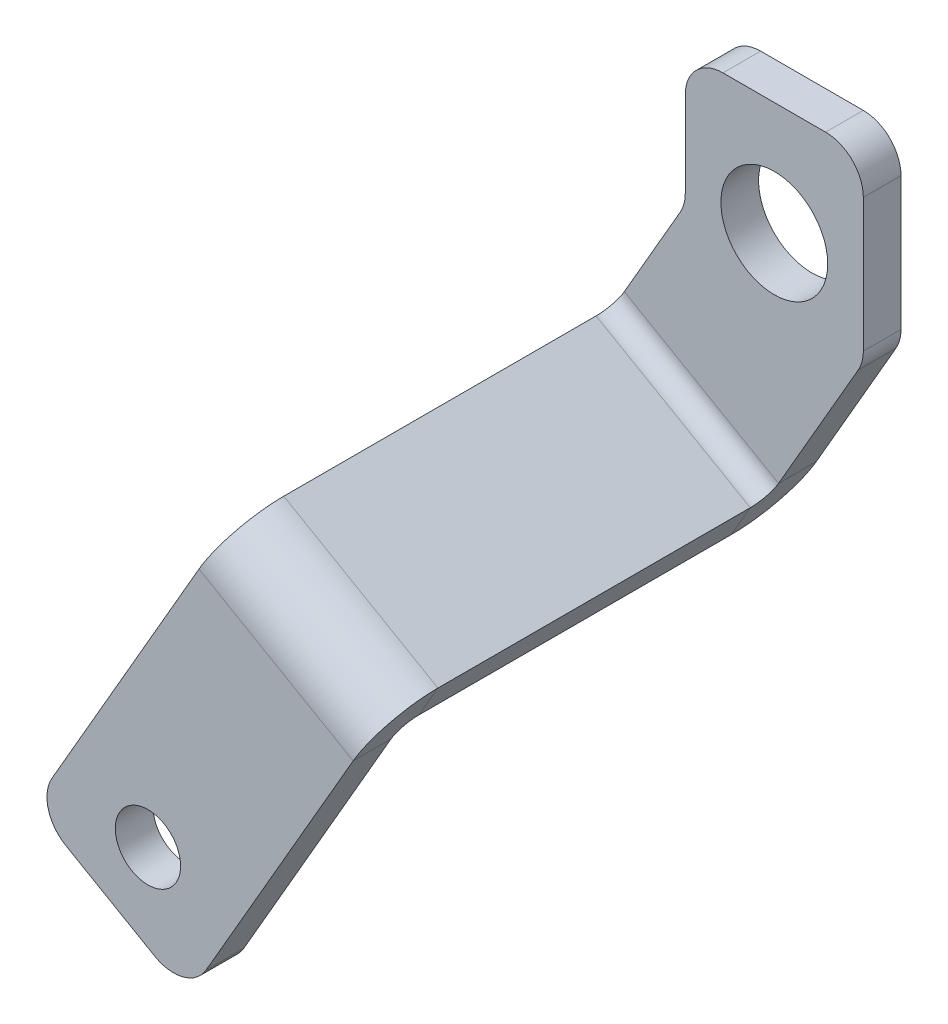
ISO-10303-21;
HEADER;
FILE_DESCRIPTION(('STEP AP214'),'2;1');
FILE_NAME('part.step','',(''),(''),'','','');
FILE_SCHEMA(('AUTOMOTIVE_DESIGN { 1 0 10303 214 1 1 1 1 }'));
ENDSEC;
DATA;
#1=APPLICATION_CONTEXT('core data for automotive mechanical design processes');
#2=APPLICATION_PROTOCOL_DEFINITION('international standard','automotive_design',2000,#1);
#3=PRODUCT_CONTEXT('',#1,'mechanical');
#4=PRODUCT('Part','Part','',(#3));
#5=PRODUCT_RELATED_PRODUCT_CATEGORY('part','',(#4));
#6=PRODUCT_DEFINITION_FORMATION('','',#4);
#7=PRODUCT_DEFINITION_CONTEXT('part definition',#1,'design');
#8=PRODUCT_DEFINITION('design','',#6,#7);
#9=PRODUCT_DEFINITION_SHAPE('','',#8);
#10=(LENGTH_UNIT() NAMED_UNIT(*) SI_UNIT(.MILLI.,.METRE.));
#11=(NAMED_UNIT(*) PLANE_ANGLE_UNIT() SI_UNIT($,.RADIAN.));
#12=(NAMED_UNIT(*) SI_UNIT($,.STERADIAN.) SOLID_ANGLE_UNIT());
#13=UNCERTAINTY_MEASURE_WITH_UNIT(LENGTH_MEASURE(1.E-05),#10,'distance_accuracy_value','');
#14=(GEOMETRIC_REPRESENTATION_CONTEXT(3) GLOBAL_UNCERTAINTY_ASSIGNED_CONTEXT((#13)) GLOBAL_UNIT_ASSIGNED_CONTEXT((#10,
#11,#12)) REPRESENTATION_CONTEXT('',''));
#15=CARTESIAN_POINT('',(0.,0.,0.));
#16=DIRECTION('',(0.,0.,1.));
#17=DIRECTION('',(1.,0.,0.));
#18=AXIS2_PLACEMENT_3D('',#15,#16,#17);
#19=CARTESIAN_POINT('',(-153.02745566794,29.1285594079911,3.175));
#20=DIRECTION('',(0.86602540378444,-0.499999999999997,0.));
#21=DIRECTION('',(0.499999999999997,0.86602540378444,0.));
#22=AXIS2_PLACEMENT_3D('',#19,#20,#21);
#23=PLANE('',#22);
#24=DIRECTION('',(-0.499999999999997,-0.86602540378444,0.));
#25=VECTOR('',#24,1.);
#26=CARTESIAN_POINT('',(-153.02745566794,29.1285594079911,0.));
#27=LINE('',#26,#25);
#28=CARTESIAN_POINT('',(-139.05745566794,53.3253091897284,0.));
#29=VERTEX_POINT('',#28);
#30=CARTESIAN_POINT('',(-151.43995566794,31.8781900650067,0.));
#31=VERTEX_POINT('',#30);
#32=EDGE_CURVE('E311',#29,#31,#27,.T.);
#33=ORIENTED_EDGE('',*,*,#32,.T.);
#34=DIRECTION('',(0.,0.,-1.));
#35=VECTOR('',#34,1.);
#36=CARTESIAN_POINT('',(-151.43995566794,31.8781900650067,3.175));
#37=LINE('',#36,#35);
#38=CARTESIAN_POINT('',(-151.43995566794,31.8781900650067,3.175));
#39=VERTEX_POINT('',#38);
#40=EDGE_CURVE('E106',#31,#39,#37,.F.);
#41=ORIENTED_EDGE('',*,*,#40,.T.);
#42=DIRECTION('',(-0.499999999999997,-0.86602540378444,0.));
#43=VECTOR('',#42,1.);
#44=CARTESIAN_POINT('',(-139.05745566794,53.3253091897284,3.175));
#45=LINE('',#44,#43);
#46=CARTESIAN_POINT('',(-139.05745566794,53.3253091897284,3.175));
#47=VERTEX_POINT('',#46);
#48=EDGE_CURVE('E320',#47,#39,#45,.T.);
#49=ORIENTED_EDGE('',*,*,#48,.F.);
#50=DIRECTION('',(0.,0.,-1.));
#51=VECTOR('',#50,1.);
#52=CARTESIAN_POINT('',(-139.05745566794,53.3253091897284,3.175));
#53=LINE('',#52,#51);
#54=EDGE_CURVE('E330',#47,#29,#53,.T.);
#55=ORIENTED_EDGE('',*,*,#54,.T.);
#56=EDGE_LOOP('',(#33,#41,#49,#55));
#57=FACE_BOUND('',#56,.T.);
#58=ADVANCED_FACE('F83',(#57),#23,.F.);
#59=CARTESIAN_POINT('',(-140.037074611173,21.6285594079912,3.175));
#60=DIRECTION('',(0.499999999999997,0.86602540378444,0.));
#61=DIRECTION('',(-0.86602540378444,0.499999999999997,0.));
#62=AXIS2_PLACEMENT_3D('',#59,#60,#61);
#63=PLANE('',#62);
#64=DIRECTION('',(0.86602540378444,-0.499999999999997,0.));
#65=VECTOR('',#64,1.);
#66=CARTESIAN_POINT('',(-140.037074611173,21.6285594079912,3.175));
#67=LINE('',#66,#65);
#68=CARTESIAN_POINT('',(-150.277825010924,27.5410594079912,3.175));
#69=VERTEX_POINT('',#68);
#70=CARTESIAN_POINT('',(-142.786705268189,23.2160594079912,3.175));
#71=VERTEX_POINT('',#70);
#72=EDGE_CURVE('E322',#69,#71,#67,.T.);
#73=ORIENTED_EDGE('',*,*,#72,.F.);
#74=DIRECTION('',(0.,0.,-1.));
#75=VECTOR('',#74,1.);
#76=CARTESIAN_POINT('',(-150.277825010924,27.5410594079912,3.175));
#77=LINE('',#76,#75);
#78=CARTESIAN_POINT('',(-150.277825010924,27.5410594079912,0.));
#79=VERTEX_POINT('',#78);
#80=EDGE_CURVE('E380',#69,#79,#77,.T.);
#81=ORIENTED_EDGE('',*,*,#80,.T.);
#82=DIRECTION('',(0.86602540378444,-0.499999999999997,0.));
#83=VECTOR('',#82,1.);
#84=CARTESIAN_POINT('',(-140.037074611173,21.6285594079912,0.));
#85=LINE('',#84,#83);
#86=CARTESIAN_POINT('',(-142.786705268189,23.2160594079912,0.));
#87=VERTEX_POINT('',#86);
#88=EDGE_CURVE('E332',#79,#87,#85,.T.);
#89=ORIENTED_EDGE('',*,*,#88,.T.);
#90=DIRECTION('',(0.,0.,-1.));
#91=VECTOR('',#90,1.);
#92=CARTESIAN_POINT('',(-142.786705268189,23.2160594079912,3.175));
#93=LINE('',#92,#91);
#94=EDGE_CURVE('E378',#87,#71,#93,.F.);
#95=ORIENTED_EDGE('',*,*,#94,.T.);
#96=EDGE_LOOP('',(#73,#81,#89,#95));
#97=FACE_BOUND('',#96,.T.);
#98=ADVANCED_FACE('F445',(#97),#63,.F.);
#99=CARTESIAN_POINT('',(-136.862074611173,27.1278207220224,3.175));
#100=DIRECTION('',(-0.86602540378444,0.499999999999997,0.));
#101=DIRECTION('',(-0.499999999999997,-0.86602540378444,0.));
#102=AXIS2_PLACEMENT_3D('',#99,#100,#101);
#103=PLANE('',#102);
#104=DIRECTION('',(0.499999999999997,0.86602540378444,0.));
#105=VECTOR('',#104,1.);
#106=CARTESIAN_POINT('',(-136.862074611173,27.1278207220224,3.175));
#107=LINE('',#106,#105);
#108=CARTESIAN_POINT('',(-138.449574611173,24.3781900650068,3.175));
#109=VERTEX_POINT('',#108);
#110=CARTESIAN_POINT('',(-126.067074611173,45.8253091897284,3.17500000000001));
#111=VERTEX_POINT('',#110);
#112=EDGE_CURVE('E325',#109,#111,#107,.T.);
#113=ORIENTED_EDGE('',*,*,#112,.F.);
#114=DIRECTION('',(0.,0.,-1.));
#115=VECTOR('',#114,1.);
#116=CARTESIAN_POINT('',(-138.449574611173,24.3781900650068,3.175));
#117=LINE('',#116,#115);
#118=CARTESIAN_POINT('',(-138.449574611173,24.3781900650068,0.));
#119=VERTEX_POINT('',#118);
#120=EDGE_CURVE('E391',#109,#119,#117,.T.);
#121=ORIENTED_EDGE('',*,*,#120,.T.);
#122=DIRECTION('',(0.499999999999997,0.86602540378444,0.));
#123=VECTOR('',#122,1.);
#124=CARTESIAN_POINT('',(-136.862074611173,27.1278207220224,0.));
#125=LINE('',#124,#123);
#126=CARTESIAN_POINT('',(-126.067074611173,45.8253091897284,0.));
#127=VERTEX_POINT('',#126);
#128=EDGE_CURVE('E335',#119,#127,#125,.T.);
#129=ORIENTED_EDGE('',*,*,#128,.T.);
#130=DIRECTION('',(0.,0.,-1.));
#131=VECTOR('',#130,1.);
#132=CARTESIAN_POINT('',(-126.067074611173,45.8253091897285,3.175));
#133=LINE('',#132,#131);
#134=EDGE_CURVE('E340',#111,#127,#133,.T.);
#135=ORIENTED_EDGE('',*,*,#134,.F.);
#136=EDGE_LOOP('',(#113,#121,#129,#135));
#137=FACE_BOUND('',#136,.T.);
#138=ADVANCED_FACE('F450',(#137),#103,.F.);
#139=CARTESIAN_POINT('',(0.,0.,3.175));
#140=DIRECTION('',(0.,0.,-1.));
#141=DIRECTION('',(-1.,0.,0.));
#142=AXIS2_PLACEMENT_3D('',#139,#140,#141);
#143=PLANE('',#142);
#144=CARTESIAN_POINT('',(-143.357265139557,30.8778207220224,3.175));
#145=DIRECTION('',(0.,0.,1.));
#146=DIRECTION('',(1.,0.,0.));
#147=AXIS2_PLACEMENT_3D('',#144,#145,#146);
#148=CIRCLE('',#147,2.75);
#149=CARTESIAN_POINT('',(-140.607265139557,30.8778207220224,3.175));
#150=VERTEX_POINT('',#149);
#151=EDGE_CURVE('E348',#150,#150,#148,.T.);
#152=ORIENTED_EDGE('',*,*,#151,.F.);
#153=EDGE_LOOP('',(#152));
#154=FACE_BOUND('',#153,.T.);
#155=ORIENTED_EDGE('',*,*,#48,.T.);
#156=CARTESIAN_POINT('',(-148.690325010924,30.2906900650068,3.175));
#157=DIRECTION('',(0.,0.,-1.));
#158=DIRECTION('',(-1.,0.,0.));
#159=AXIS2_PLACEMENT_3D('',#156,#157,#158);
#160=CIRCLE('',#159,3.175);
#161=EDGE_CURVE('E389',#39,#69,#160,.F.);
#162=ORIENTED_EDGE('',*,*,#161,.T.);
#163=ORIENTED_EDGE('',*,*,#72,.T.);
#164=CARTESIAN_POINT('',(-141.199205268189,25.9656900650068,3.175));
#165=DIRECTION('',(0.,0.,-1.));
#166=DIRECTION('',(-1.,0.,0.));
#167=AXIS2_PLACEMENT_3D('',#164,#165,#166);
#168=CIRCLE('',#167,3.175);
#169=EDGE_CURVE('E98',#71,#109,#168,.F.);
#170=ORIENTED_EDGE('',*,*,#169,.T.);
#171=ORIENTED_EDGE('',*,*,#112,.T.);
#172=DIRECTION('',(-0.86602540378444,0.499999999999997,0.));
#173=VECTOR('',#172,1.);
#174=CARTESIAN_POINT('',(-126.067074611173,45.8253091897285,3.175));
#175=LINE('',#174,#173);
#176=EDGE_CURVE('E327',#111,#47,#175,.T.);
#177=ORIENTED_EDGE('',*,*,#176,.T.);
#178=EDGE_LOOP('',(#155,#162,#163,#170,#171,#177));
#179=FACE_BOUND('',#178,.T.);
#180=ADVANCED_FACE('F510',(#154,#179),#143,.F.);
#181=CARTESIAN_POINT('',(0.,0.,0.));
#182=DIRECTION('',(0.,0.,-1.));
#183=DIRECTION('',(-1.,0.,0.));
#184=AXIS2_PLACEMENT_3D('',#181,#182,#183);
#185=PLANE('',#184);
#186=CARTESIAN_POINT('',(-143.357265139557,30.8778207220224,0.));
#187=DIRECTION('',(0.,0.,-1.));
#188=DIRECTION('',(-1.,0.,0.));
#189=AXIS2_PLACEMENT_3D('',#186,#187,#188);
#190=CIRCLE('',#189,2.75);
#191=CARTESIAN_POINT('',(-146.107265139557,30.8778207220224,0.));
#192=VERTEX_POINT('',#191);
#193=EDGE_CURVE('E344',#192,#192,#190,.T.);
#194=ORIENTED_EDGE('',*,*,#193,.F.);
#195=EDGE_LOOP('',(#194));
#196=FACE_BOUND('',#195,.T.);
#197=ORIENTED_EDGE('',*,*,#88,.F.);
#198=CARTESIAN_POINT('',(-148.690325010924,30.2906900650068,0.));
#199=DIRECTION('',(0.,0.,-1.));
#200=DIRECTION('',(-1.,0.,0.));
#201=AXIS2_PLACEMENT_3D('',#198,#199,#200);
#202=CIRCLE('',#201,3.175);
#203=EDGE_CURVE('E385',#79,#31,#202,.T.);
#204=ORIENTED_EDGE('',*,*,#203,.T.);
#205=ORIENTED_EDGE('',*,*,#32,.F.);
#206=DIRECTION('',(-0.86602540378444,0.499999999999997,0.));
#207=VECTOR('',#206,1.);
#208=CARTESIAN_POINT('',(-126.067074611173,45.8253091897285,0.));
#209=LINE('',#208,#207);
#210=EDGE_CURVE('E323',#127,#29,#209,.T.);
#211=ORIENTED_EDGE('',*,*,#210,.F.);
#212=ORIENTED_EDGE('',*,*,#128,.F.);
#213=CARTESIAN_POINT('',(-141.199205268189,25.9656900650068,0.));
#214=DIRECTION('',(0.,0.,-1.));
#215=DIRECTION('',(-1.,0.,0.));
#216=AXIS2_PLACEMENT_3D('',#213,#214,#215);
#217=CIRCLE('',#216,3.175);
#218=EDGE_CURVE('E383',#119,#87,#217,.T.);
#219=ORIENTED_EDGE('',*,*,#218,.T.);
#220=EDGE_LOOP('',(#197,#204,#205,#211,#212,#219));
#221=FACE_BOUND('',#220,.T.);
#222=ADVANCED_FACE('F522',(#196,#221),#185,.T.);
#223=CARTESIAN_POINT('',(-139.05745566794,53.3253091897284,-1.5875));
#224=DIRECTION('',(-0.866025403784441,0.499999999999997,0.));
#225=DIRECTION('',(-0.499999999999997,-0.866025403784441,0.));
#226=AXIS2_PLACEMENT_3D('',#223,#224,#225);
#227=PLANE('',#226);
#228=DIRECTION('',(-0.499999999999997,-0.86602540378444,0.));
#229=VECTOR('',#228,1.);
#230=CARTESIAN_POINT('',(-136.67620566794,57.4497551752517,-1.58749999999998));
#231=LINE('',#230,#229);
#232=CARTESIAN_POINT('',(-138.26370566794,54.7001245182362,-1.58749999999999));
#233=VERTEX_POINT('',#232);
#234=CARTESIAN_POINT('',(-136.67620566794,57.4497551752518,-1.58749999999998));
#235=VERTEX_POINT('',#234);
#236=EDGE_CURVE('E274',#233,#235,#231,.F.);
#237=ORIENTED_EDGE('',*,*,#236,.F.);
#238=CARTESIAN_POINT('',(-139.05745566794,53.3253091897284,-1.5875));
#239=DIRECTION('',(0.866025403784441,-0.499999999999997,0.));
#240=DIRECTION('',(0.499999999999997,0.866025403784441,0.));
#241=AXIS2_PLACEMENT_3D('',#238,#239,#240);
#242=CIRCLE('',#241,1.58750000000001);
#243=EDGE_CURVE('E315',#29,#233,#242,.F.);
#244=ORIENTED_EDGE('',*,*,#243,.F.);
#245=ORIENTED_EDGE('',*,*,#54,.F.);
#246=CARTESIAN_POINT('',(-139.05745566794,53.3253091897284,-1.5875));
#247=DIRECTION('',(0.866025403784441,-0.499999999999997,0.));
#248=DIRECTION('',(0.499999999999997,0.866025403784441,0.));
#249=AXIS2_PLACEMENT_3D('',#246,#247,#248);
#250=CIRCLE('',#249,4.76250000000001);
#251=EDGE_CURVE('E308',#47,#235,#250,.F.);
#252=ORIENTED_EDGE('',*,*,#251,.T.);
#253=EDGE_LOOP('',(#237,#244,#245,#252));
#254=FACE_BOUND('',#253,.T.);
#255=ADVANCED_FACE('F490',(#254),#227,.T.);
#256=CARTESIAN_POINT('',(-126.067074611173,45.8253091897284,-1.5875));
#257=DIRECTION('',(-0.866025403784441,0.499999999999997,0.));
#258=DIRECTION('',(-0.499999999999997,-0.866025403784441,0.));
#259=AXIS2_PLACEMENT_3D('',#256,#257,#258);
#260=PLANE('',#259);
#261=CARTESIAN_POINT('',(-126.067074611173,45.8253091897284,-1.5875));
#262=DIRECTION('',(0.866025403784441,-0.499999999999997,0.));
#263=DIRECTION('',(0.499999999999997,0.866025403784441,0.));
#264=AXIS2_PLACEMENT_3D('',#261,#262,#263);
#265=CIRCLE('',#264,1.58750000000001);
#266=CARTESIAN_POINT('',(-125.273324611173,47.2001245182362,-1.5875));
#267=VERTEX_POINT('',#266);
#268=EDGE_CURVE('E282',#267,#127,#265,.T.);
#269=ORIENTED_EDGE('',*,*,#268,.F.);
#270=DIRECTION('',(-0.499999999999997,-0.86602540378444,0.));
#271=VECTOR('',#270,1.);
#272=CARTESIAN_POINT('',(-125.273324611173,47.2001245182362,-1.5875));
#273=LINE('',#272,#271);
#274=CARTESIAN_POINT('',(-123.685824611173,49.9497551752518,-1.58749999999999));
#275=VERTEX_POINT('',#274);
#276=EDGE_CURVE('E301',#267,#275,#273,.F.);
#277=ORIENTED_EDGE('',*,*,#276,.T.);
#278=CARTESIAN_POINT('',(-126.067074611173,45.8253091897284,-1.5875));
#279=DIRECTION('',(0.866025403784441,-0.499999999999997,0.));
#280=DIRECTION('',(0.499999999999997,0.866025403784441,0.));
#281=AXIS2_PLACEMENT_3D('',#278,#279,#280);
#282=CIRCLE('',#281,4.76250000000001);
#283=EDGE_CURVE('E312',#275,#111,#282,.T.);
#284=ORIENTED_EDGE('',*,*,#283,.T.);
#285=ORIENTED_EDGE('',*,*,#134,.T.);
#286=EDGE_LOOP('',(#269,#277,#284,#285));
#287=FACE_BOUND('',#286,.T.);
#288=ADVANCED_FACE('F505',(#287),#260,.F.);
#289=CARTESIAN_POINT('',(-126.067074611173,45.8253091897284,-1.5875));
#290=DIRECTION('',(0.866025403784441,-0.499999999999997,0.));
#291=DIRECTION('',(0.499999999999997,0.866025403784441,0.));
#292=AXIS2_PLACEMENT_3D('',#289,#290,#291);
#293=CYLINDRICAL_SURFACE('',#292,4.76250000000001);
#294=ORIENTED_EDGE('',*,*,#176,.F.);
#295=ORIENTED_EDGE('',*,*,#283,.F.);
#296=DIRECTION('',(0.86602540378444,-0.499999999999997,0.));
#297=VECTOR('',#296,1.);
#298=CARTESIAN_POINT('',(-136.67620566794,57.4497551752515,-1.58749999999998));
#299=LINE('',#298,#297);
#300=EDGE_CURVE('E299',#275,#235,#299,.F.);
#301=ORIENTED_EDGE('',*,*,#300,.T.);
#302=ORIENTED_EDGE('',*,*,#251,.F.);
#303=EDGE_LOOP('',(#294,#295,#301,#302));
#304=FACE_BOUND('',#303,.T.);
#305=ADVANCED_FACE('F509',(#304),#293,.T.);
#306=CARTESIAN_POINT('',(-126.067074611173,45.8253091897284,-1.5875));
#307=DIRECTION('',(0.866025403784441,-0.499999999999997,0.));
#308=DIRECTION('',(0.499999999999997,0.866025403784441,0.));
#309=AXIS2_PLACEMENT_3D('',#306,#307,#308);
#310=CYLINDRICAL_SURFACE('',#309,1.58750000000001);
#311=ORIENTED_EDGE('',*,*,#210,.T.);
#312=ORIENTED_EDGE('',*,*,#243,.T.);
#313=DIRECTION('',(0.86602540378444,-0.499999999999997,0.));
#314=VECTOR('',#313,1.);
#315=CARTESIAN_POINT('',(-138.26370566794,54.700124518236,-1.58749999999999));
#316=LINE('',#315,#314);
#317=EDGE_CURVE('E304',#233,#267,#316,.T.);
#318=ORIENTED_EDGE('',*,*,#317,.T.);
#319=ORIENTED_EDGE('',*,*,#268,.T.);
#320=EDGE_LOOP('',(#311,#312,#318,#319));
#321=FACE_BOUND('',#320,.T.);
#322=ADVANCED_FACE('F495',(#321),#310,.F.);
#323=CARTESIAN_POINT('',(-123.685824611173,49.9497551752515,-27.899995));
#324=DIRECTION('',(-0.86602540378444,0.499999999999997,0.));
#325=DIRECTION('',(-0.499999999999997,-0.86602540378444,0.));
#326=AXIS2_PLACEMENT_3D('',#323,#324,#325);
#327=PLANE('',#326);
#328=ORIENTED_EDGE('',*,*,#276,.F.);
#329=DIRECTION('',(0.,0.,1.));
#330=VECTOR('',#329,1.);
#331=CARTESIAN_POINT('',(-125.273324611173,47.2001245182359,-27.899995));
#332=LINE('',#331,#330);
#333=CARTESIAN_POINT('',(-125.273324611173,47.2001245182359,-27.899995));
#334=VERTEX_POINT('',#333);
#335=EDGE_CURVE('E297',#267,#334,#332,.F.);
#336=ORIENTED_EDGE('',*,*,#335,.T.);
#337=DIRECTION('',(-0.499999999999997,-0.86602540378444,0.));
#338=VECTOR('',#337,1.);
#339=CARTESIAN_POINT('',(-123.685824611173,49.9497551752515,-27.899995));
#340=LINE('',#339,#338);
#341=CARTESIAN_POINT('',(-123.685824611173,49.9497551752515,-27.899995));
#342=VERTEX_POINT('',#341);
#343=EDGE_CURVE('E279',#342,#334,#340,.T.);
#344=ORIENTED_EDGE('',*,*,#343,.F.);
#345=DIRECTION('',(0.,0.,-1.));
#346=VECTOR('',#345,1.);
#347=CARTESIAN_POINT('',(-123.685824611173,49.9497551752518,-3.75116095395736E-12));
#348=LINE('',#347,#346);
#349=EDGE_CURVE('E291',#275,#342,#348,.T.);
#350=ORIENTED_EDGE('',*,*,#349,.F.);
#351=EDGE_LOOP('',(#328,#336,#344,#350));
#352=FACE_BOUND('',#351,.T.);
#353=ADVANCED_FACE('F503',(#352),#327,.F.);
#354=CARTESIAN_POINT('',(-136.67620566794,57.4497551752518,0.));
#355=DIRECTION('',(0.86602540378444,-0.499999999999997,0.));
#356=DIRECTION('',(0.499999999999997,0.86602540378444,0.));
#357=AXIS2_PLACEMENT_3D('',#354,#355,#356);
#358=PLANE('',#357);
#359=ORIENTED_EDGE('',*,*,#236,.T.);
#360=DIRECTION('',(0.,0.,1.));
#361=VECTOR('',#360,1.);
#362=CARTESIAN_POINT('',(-136.67620566794,57.4497551752518,-4.33254190104343E-12));
#363=LINE('',#362,#361);
#364=CARTESIAN_POINT('',(-136.676205667939,57.4497551752514,-27.899995));
#365=VERTEX_POINT('',#364);
#366=EDGE_CURVE('E286',#365,#235,#363,.T.);
#367=ORIENTED_EDGE('',*,*,#366,.F.);
#368=DIRECTION('',(-0.499999999999997,-0.86602540378444,0.));
#369=VECTOR('',#368,1.);
#370=CARTESIAN_POINT('',(-136.676205667939,57.4497551752514,-27.899995));
#371=LINE('',#370,#369);
#372=CARTESIAN_POINT('',(-138.263705667939,54.7001245182359,-27.899995));
#373=VERTEX_POINT('',#372);
#374=EDGE_CURVE('E283',#365,#373,#371,.T.);
#375=ORIENTED_EDGE('',*,*,#374,.T.);
#376=DIRECTION('',(0.,0.,-1.));
#377=VECTOR('',#376,1.);
#378=CARTESIAN_POINT('',(-138.26370566794,54.7001245182362,0.));
#379=LINE('',#378,#377);
#380=EDGE_CURVE('E293',#373,#233,#379,.F.);
#381=ORIENTED_EDGE('',*,*,#380,.T.);
#382=EDGE_LOOP('',(#359,#367,#375,#381));
#383=FACE_BOUND('',#382,.T.);
#384=ADVANCED_FACE('F487',(#383),#358,.F.);
#385=CARTESIAN_POINT('',(-9.29257770550245,-16.0952167192122,0.));
#386=DIRECTION('',(-0.499999999999998,-0.86602540378444,0.));
#387=DIRECTION('',(0.86602540378444,-0.499999999999997,0.));
#388=AXIS2_PLACEMENT_3D('',#385,#386,#387);
#389=PLANE('',#388);
#390=ORIENTED_EDGE('',*,*,#300,.F.);
#391=ORIENTED_EDGE('',*,*,#349,.T.);
#392=DIRECTION('',(-0.86602540378444,0.499999999999998,0.));
#393=VECTOR('',#392,1.);
#394=CARTESIAN_POINT('',(-9.29257770550241,-16.0952167192121,-27.899995));
#395=LINE('',#394,#393);
#396=EDGE_CURVE('E289',#342,#365,#395,.T.);
#397=ORIENTED_EDGE('',*,*,#396,.T.);
#398=ORIENTED_EDGE('',*,*,#366,.T.);
#399=EDGE_LOOP('',(#390,#391,#397,#398));
#400=FACE_BOUND('',#399,.T.);
#401=ADVANCED_FACE('F483',(#400),#389,.F.);
#402=CARTESIAN_POINT('',(-10.8800777055024,-18.8448473762278,0.));
#403=DIRECTION('',(-0.499999999999998,-0.86602540378444,0.));
#404=DIRECTION('',(0.86602540378444,-0.499999999999997,0.));
#405=AXIS2_PLACEMENT_3D('',#402,#403,#404);
#406=PLANE('',#405);
#407=ORIENTED_EDGE('',*,*,#335,.F.);
#408=ORIENTED_EDGE('',*,*,#317,.F.);
#409=ORIENTED_EDGE('',*,*,#380,.F.);
#410=DIRECTION('',(0.86602540378444,-0.499999999999998,0.));
#411=VECTOR('',#410,1.);
#412=CARTESIAN_POINT('',(-138.263705667939,54.7001245182358,-27.899995));
#413=LINE('',#412,#411);
#414=EDGE_CURVE('E231',#334,#373,#413,.F.);
#415=ORIENTED_EDGE('',*,*,#414,.F.);
#416=EDGE_LOOP('',(#407,#408,#409,#415));
#417=FACE_BOUND('',#416,.T.);
#418=ADVANCED_FACE('F500',(#417),#406,.T.);
#419=CARTESIAN_POINT('',(-122.892074611173,51.3245705037593,-27.899995));
#420=DIRECTION('',(0.86602540378444,-0.499999999999998,0.));
#421=DIRECTION('',(0.499999999999998,0.86602540378444,0.));
#422=AXIS2_PLACEMENT_3D('',#419,#420,#421);
#423=PLANE('',#422);
#424=DIRECTION('',(0.,0.,1.));
#425=VECTOR('',#424,1.);
#426=CARTESIAN_POINT('',(-122.892074611173,51.3245705037593,-32.662495));
#427=LINE('',#426,#425);
#428=CARTESIAN_POINT('',(-122.892074611173,51.3245705037593,-29.487495));
#429=VERTEX_POINT('',#428);
#430=CARTESIAN_POINT('',(-122.892074611173,51.3245705037593,-32.662495));
#431=VERTEX_POINT('',#430);
#432=EDGE_CURVE('E270',#429,#431,#427,.F.);
#433=ORIENTED_EDGE('',*,*,#432,.F.);
#434=CARTESIAN_POINT('',(-122.892074611173,51.3245705037593,-27.899995));
#435=DIRECTION('',(-0.86602540378444,0.499999999999998,0.));
#436=DIRECTION('',(-0.499999999999998,-0.86602540378444,0.));
#437=AXIS2_PLACEMENT_3D('',#434,#435,#436);
#438=CIRCLE('',#437,1.5875);
#439=EDGE_CURVE('E235',#342,#429,#438,.F.);
#440=ORIENTED_EDGE('',*,*,#439,.F.);
#441=ORIENTED_EDGE('',*,*,#343,.T.);
#442=CARTESIAN_POINT('',(-122.892074611173,51.3245705037593,-27.899995));
#443=DIRECTION('',(-0.86602540378444,0.499999999999998,0.));
#444=DIRECTION('',(-0.499999999999998,-0.86602540378444,0.));
#445=AXIS2_PLACEMENT_3D('',#442,#443,#444);
#446=CIRCLE('',#445,4.7625);
#447=EDGE_CURVE('E234',#334,#431,#446,.F.);
#448=ORIENTED_EDGE('',*,*,#447,.T.);
#449=EDGE_LOOP('',(#433,#440,#441,#448));
#450=FACE_BOUND('',#449,.T.);
#451=ADVANCED_FACE('F476',(#450),#423,.T.);
#452=CARTESIAN_POINT('',(-135.882455667939,58.8245705037593,-27.899995));
#453=DIRECTION('',(0.86602540378444,-0.499999999999998,0.));
#454=DIRECTION('',(0.499999999999998,0.86602540378444,0.));
#455=AXIS2_PLACEMENT_3D('',#452,#453,#454);
#456=PLANE('',#455);
#457=CARTESIAN_POINT('',(-135.882455667939,58.8245705037593,-27.899995));
#458=DIRECTION('',(-0.86602540378444,0.499999999999998,0.));
#459=DIRECTION('',(-0.499999999999998,-0.86602540378444,0.));
#460=AXIS2_PLACEMENT_3D('',#457,#458,#459);
#461=CIRCLE('',#460,1.5875);
#462=CARTESIAN_POINT('',(-135.882455667939,58.8245705037593,-29.487495));
#463=VERTEX_POINT('',#462);
#464=EDGE_CURVE('E242',#463,#365,#461,.T.);
#465=ORIENTED_EDGE('',*,*,#464,.F.);
#466=DIRECTION('',(0.,0.,1.));
#467=VECTOR('',#466,1.);
#468=CARTESIAN_POINT('',(-135.882455667939,58.8245705037593,-29.487495));
#469=LINE('',#468,#467);
#470=CARTESIAN_POINT('',(-135.882455667939,58.8245705037593,-32.662495));
#471=VERTEX_POINT('',#470);
#472=EDGE_CURVE('E239',#463,#471,#469,.F.);
#473=ORIENTED_EDGE('',*,*,#472,.T.);
#474=CARTESIAN_POINT('',(-135.882455667939,58.8245705037593,-27.899995));
#475=DIRECTION('',(-0.86602540378444,0.499999999999998,0.));
#476=DIRECTION('',(-0.499999999999998,-0.86602540378444,0.));
#477=AXIS2_PLACEMENT_3D('',#474,#475,#476);
#478=CIRCLE('',#477,4.7625);
#479=EDGE_CURVE('E223',#471,#373,#478,.T.);
#480=ORIENTED_EDGE('',*,*,#479,.T.);
#481=ORIENTED_EDGE('',*,*,#374,.F.);
#482=EDGE_LOOP('',(#465,#473,#480,#481));
#483=FACE_BOUND('',#482,.T.);
#484=ADVANCED_FACE('F240',(#483),#456,.F.);
#485=CARTESIAN_POINT('',(-135.882455667939,58.8245705037593,-27.899995));
#486=DIRECTION('',(-0.86602540378444,0.499999999999998,0.));
#487=DIRECTION('',(0.,0.,-1.));
#488=AXIS2_PLACEMENT_3D('',#485,#486,#487);
#489=CYLINDRICAL_SURFACE('',#488,4.7625);
#490=ORIENTED_EDGE('',*,*,#414,.T.);
#491=ORIENTED_EDGE('',*,*,#479,.F.);
#492=DIRECTION('',(-0.86602540378444,0.499999999999998,0.));
#493=VECTOR('',#492,1.);
#494=CARTESIAN_POINT('',(-122.892074611173,51.3245705037593,-32.662495));
#495=LINE('',#494,#493);
#496=EDGE_CURVE('E228',#471,#431,#495,.F.);
#497=ORIENTED_EDGE('',*,*,#496,.T.);
#498=ORIENTED_EDGE('',*,*,#447,.F.);
#499=EDGE_LOOP('',(#490,#491,#497,#498));
#500=FACE_BOUND('',#499,.T.);
#501=ADVANCED_FACE('F225',(#500),#489,.T.);
#502=CARTESIAN_POINT('',(-135.882455667939,58.8245705037593,-27.899995));
#503=DIRECTION('',(-0.86602540378444,0.499999999999998,0.));
#504=DIRECTION('',(0.,0.,-1.));
#505=AXIS2_PLACEMENT_3D('',#502,#503,#504);
#506=CYLINDRICAL_SURFACE('',#505,1.5875);
#507=ORIENTED_EDGE('',*,*,#396,.F.);
#508=ORIENTED_EDGE('',*,*,#439,.T.);
#509=DIRECTION('',(-0.86602540378444,0.499999999999998,0.));
#510=VECTOR('',#509,1.);
#511=CARTESIAN_POINT('',(-122.892074611173,51.3245705037593,-29.487495));
#512=LINE('',#511,#510);
#513=EDGE_CURVE('E247',#429,#463,#512,.T.);
#514=ORIENTED_EDGE('',*,*,#513,.T.);
#515=ORIENTED_EDGE('',*,*,#464,.T.);
#516=EDGE_LOOP('',(#507,#508,#514,#515));
#517=FACE_BOUND('',#516,.T.);
#518=ADVANCED_FACE('F479',(#517),#506,.F.);
#519=CARTESIAN_POINT('',(-133.501205667939,62.9490164892826,-32.662495));
#520=DIRECTION('',(0.866025403784438,-0.500000000000002,0.));
#521=DIRECTION('',(0.500000000000002,0.866025403784438,0.));
#522=AXIS2_PLACEMENT_3D('',#519,#520,#521);
#523=PLANE('',#522);
#524=DIRECTION('',(-0.500000000000002,-0.866025403784438,0.));
#525=VECTOR('',#524,1.);
#526=CARTESIAN_POINT('',(-133.501205667939,62.9490164892826,-29.487495));
#527=LINE('',#526,#525);
#528=CARTESIAN_POINT('',(-131.173693954157,66.9803850327649,-29.487495));
#529=VERTEX_POINT('',#528);
#530=EDGE_CURVE('E256',#463,#529,#527,.F.);
#531=ORIENTED_EDGE('',*,*,#530,.T.);
#532=DIRECTION('',(0.,0.,-1.));
#533=VECTOR('',#532,1.);
#534=CARTESIAN_POINT('',(-131.173693954157,66.9803850327649,-32.662495));
#535=LINE('',#534,#533);
#536=CARTESIAN_POINT('',(-131.173693954157,66.9803850327649,-32.662495));
#537=VERTEX_POINT('',#536);
#538=EDGE_CURVE('E261',#529,#537,#535,.T.);
#539=ORIENTED_EDGE('',*,*,#538,.T.);
#540=DIRECTION('',(0.500000000000002,0.866025403784438,0.));
#541=VECTOR('',#540,1.);
#542=CARTESIAN_POINT('',(-127.383627962436,73.5449718944641,-32.662495));
#543=LINE('',#542,#541);
#544=EDGE_CURVE('E253',#471,#537,#543,.T.);
#545=ORIENTED_EDGE('',*,*,#544,.F.);
#546=ORIENTED_EDGE('',*,*,#472,.F.);
#547=EDGE_LOOP('',(#531,#539,#545,#546));
#548=FACE_BOUND('',#547,.T.);
#549=ADVANCED_FACE('F259',(#548),#523,.F.);
#550=CARTESIAN_POINT('',(-123.685824611173,49.9497551752515,-32.662495));
#551=DIRECTION('',(-0.866025403784437,0.500000000000002,0.));
#552=DIRECTION('',(-0.500000000000002,-0.866025403784437,0.));
#553=AXIS2_PLACEMENT_3D('',#550,#551,#552);
#554=PLANE('',#553);
#555=DIRECTION('',(-0.500000000000002,-0.866025403784437,0.));
#556=VECTOR('',#555,1.);
#557=CARTESIAN_POINT('',(-114.39324690567,66.0449718944642,-32.662495));
#558=LINE('',#557,#556);
#559=CARTESIAN_POINT('',(-116.173693954157,62.9611471462982,-32.662495));
#560=VERTEX_POINT('',#559);
#561=EDGE_CURVE('E255',#560,#431,#558,.T.);
#562=ORIENTED_EDGE('',*,*,#561,.F.);
#563=DIRECTION('',(0.,0.,-1.));
#564=VECTOR('',#563,1.);
#565=CARTESIAN_POINT('',(-116.173693954157,62.9611471462982,-29.487495));
#566=LINE('',#565,#564);
#567=CARTESIAN_POINT('',(-116.173693954157,62.9611471462982,-29.487495));
#568=VERTEX_POINT('',#567);
#569=EDGE_CURVE('E359',#560,#568,#566,.F.);
#570=ORIENTED_EDGE('',*,*,#569,.T.);
#571=DIRECTION('',(0.500000000000002,0.866025403784437,0.));
#572=VECTOR('',#571,1.);
#573=CARTESIAN_POINT('',(-123.685824611173,49.9497551752515,-29.487495));
#574=LINE('',#573,#572);
#575=EDGE_CURVE('E262',#568,#429,#574,.F.);
#576=ORIENTED_EDGE('',*,*,#575,.T.);
#577=ORIENTED_EDGE('',*,*,#432,.T.);
#578=EDGE_LOOP('',(#562,#570,#576,#577));
#579=FACE_BOUND('',#578,.T.);
#580=ADVANCED_FACE('F472',(#579),#554,.F.);
#581=CARTESIAN_POINT('',(0.,0.,-32.662495));
#582=DIRECTION('',(0.,0.,1.));
#583=DIRECTION('',(1.,0.,0.));
#584=AXIS2_PLACEMENT_3D('',#581,#582,#583);
#585=PLANE('',#584);
#586=CARTESIAN_POINT('',(-123.248324611173,69.4110034603297,-32.662495));
#587=DIRECTION('',(0.,0.,1.));
#588=DIRECTION('',(1.,0.,0.));
#589=AXIS2_PLACEMENT_3D('',#586,#587,#588);
#590=CIRCLE('',#589,4.5);
#591=CARTESIAN_POINT('',(-118.748324611173,69.4110034603297,-32.662495));
#592=VERTEX_POINT('',#591);
#593=EDGE_CURVE('E890',#592,#592,#590,.T.);
#594=ORIENTED_EDGE('',*,*,#593,.T.);
#595=EDGE_LOOP('',(#594));
#596=FACE_BOUND('',#595,.T.);
#597=DIRECTION('',(0.,-1.,0.));
#598=VECTOR('',#597,1.);
#599=CARTESIAN_POINT('',(-115.748324611173,63.6979084603295,-32.662495));
#600=LINE('',#599,#598);
#601=CARTESIAN_POINT('',(-115.748324611173,75.7629084603295,-32.662495));
#602=VERTEX_POINT('',#601);
#603=CARTESIAN_POINT('',(-115.748324611173,64.5486471462982,-32.662495));
#604=VERTEX_POINT('',#603);
#605=EDGE_CURVE('E414',#602,#604,#600,.T.);
#606=ORIENTED_EDGE('',*,*,#605,.T.);
#607=CARTESIAN_POINT('',(-118.923324611173,64.5486471462982,-32.662495));
#608=DIRECTION('',(0.,0.,1.));
#609=DIRECTION('',(1.,0.,0.));
#610=AXIS2_PLACEMENT_3D('',#607,#608,#609);
#611=CIRCLE('',#610,3.175);
#612=EDGE_CURVE('E357',#604,#560,#611,.F.);
#613=ORIENTED_EDGE('',*,*,#612,.T.);
#614=ORIENTED_EDGE('',*,*,#561,.T.);
#615=ORIENTED_EDGE('',*,*,#496,.F.);
#616=ORIENTED_EDGE('',*,*,#544,.T.);
#617=CARTESIAN_POINT('',(-133.923324611173,68.5678850327649,-32.662495));
#618=DIRECTION('',(0.,0.,1.));
#619=DIRECTION('',(1.,0.,0.));
#620=AXIS2_PLACEMENT_3D('',#617,#618,#619);
#621=CIRCLE('',#620,3.175);
#622=CARTESIAN_POINT('',(-130.748324611173,68.5678850327649,-32.662495));
#623=VERTEX_POINT('',#622);
#624=EDGE_CURVE('E91',#537,#623,#621,.T.);
#625=ORIENTED_EDGE('',*,*,#624,.T.);
#626=DIRECTION('',(0.,1.,0.));
#627=VECTOR('',#626,1.);
#628=CARTESIAN_POINT('',(-130.748324611173,78.9379084603295,-32.662495));
#629=LINE('',#628,#627);
#630=CARTESIAN_POINT('',(-130.748324611173,75.7629084603295,-32.662495));
#631=VERTEX_POINT('',#630);
#632=EDGE_CURVE('E347',#623,#631,#629,.T.);
#633=ORIENTED_EDGE('',*,*,#632,.T.);
#634=CARTESIAN_POINT('',(-127.573324611173,75.7629084603295,-32.662495));
#635=DIRECTION('',(0.,0.,1.));
#636=DIRECTION('',(1.,0.,0.));
#637=AXIS2_PLACEMENT_3D('',#634,#635,#636);
#638=CIRCLE('',#637,3.175);
#639=CARTESIAN_POINT('',(-127.573324611173,78.9379084603295,-32.662495));
#640=VERTEX_POINT('',#639);
#641=EDGE_CURVE('E355',#631,#640,#638,.F.);
#642=ORIENTED_EDGE('',*,*,#641,.T.);
#643=DIRECTION('',(1.,0.,0.));
#644=VECTOR('',#643,1.);
#645=CARTESIAN_POINT('',(-130.748324611173,78.9379084603295,-32.662495));
#646=LINE('',#645,#644);
#647=CARTESIAN_POINT('',(-118.923324611173,78.9379084603295,-32.662495));
#648=VERTEX_POINT('',#647);
#649=EDGE_CURVE('E402',#640,#648,#646,.T.);
#650=ORIENTED_EDGE('',*,*,#649,.T.);
#651=CARTESIAN_POINT('',(-118.923324611173,75.7629084603295,-32.662495));
#652=DIRECTION('',(0.,0.,1.));
#653=DIRECTION('',(1.,0.,0.));
#654=AXIS2_PLACEMENT_3D('',#651,#652,#653);
#655=CIRCLE('',#654,3.175);
#656=EDGE_CURVE('E353',#648,#602,#655,.F.);
#657=ORIENTED_EDGE('',*,*,#656,.T.);
#658=EDGE_LOOP('',(#606,#613,#614,#615,#616,#625,#633,#642,#650,#657));
#659=FACE_BOUND('',#658,.T.);
#660=ADVANCED_FACE('F252',(#596,#659),#585,.F.);
#661=CARTESIAN_POINT('',(0.,0.,-29.487495));
#662=DIRECTION('',(0.,0.,1.));
#663=DIRECTION('',(1.,0.,0.));
#664=AXIS2_PLACEMENT_3D('',#661,#662,#663);
#665=PLANE('',#664);
#666=CARTESIAN_POINT('',(-123.248324611173,69.4110034603297,-29.487495));
#667=DIRECTION('',(0.,0.,1.));
#668=DIRECTION('',(1.,0.,0.));
#669=AXIS2_PLACEMENT_3D('',#666,#667,#668);
#670=CIRCLE('',#669,4.49999999999999);
#671=CARTESIAN_POINT('',(-118.748324611173,69.4110034603297,-29.487495));
#672=VERTEX_POINT('',#671);
#673=EDGE_CURVE('E893',#672,#672,#670,.T.);
#674=ORIENTED_EDGE('',*,*,#673,.F.);
#675=EDGE_LOOP('',(#674));
#676=FACE_BOUND('',#675,.T.);
#677=ORIENTED_EDGE('',*,*,#575,.F.);
#678=CARTESIAN_POINT('',(-118.923324611173,64.5486471462982,-29.487495));
#679=DIRECTION('',(0.,0.,1.));
#680=DIRECTION('',(1.,0.,0.));
#681=AXIS2_PLACEMENT_3D('',#678,#679,#680);
#682=CIRCLE('',#681,3.175);
#683=CARTESIAN_POINT('',(-115.748324611173,64.5486471462982,-29.487495));
#684=VERTEX_POINT('',#683);
#685=EDGE_CURVE('E365',#568,#684,#682,.T.);
#686=ORIENTED_EDGE('',*,*,#685,.T.);
#687=DIRECTION('',(0.,-1.,0.));
#688=VECTOR('',#687,1.);
#689=CARTESIAN_POINT('',(-115.748324611173,63.6979084603295,-29.487495));
#690=LINE('',#689,#688);
#691=CARTESIAN_POINT('',(-115.748324611173,75.7629084603295,-29.487495));
#692=VERTEX_POINT('',#691);
#693=EDGE_CURVE('E273',#692,#684,#690,.T.);
#694=ORIENTED_EDGE('',*,*,#693,.F.);
#695=CARTESIAN_POINT('',(-118.923324611173,75.7629084603295,-29.487495));
#696=DIRECTION('',(0.,0.,1.));
#697=DIRECTION('',(1.,0.,0.));
#698=AXIS2_PLACEMENT_3D('',#695,#696,#697);
#699=CIRCLE('',#698,3.175);
#700=CARTESIAN_POINT('',(-118.923324611173,78.9379084603295,-29.487495));
#701=VERTEX_POINT('',#700);
#702=EDGE_CURVE('E361',#692,#701,#699,.T.);
#703=ORIENTED_EDGE('',*,*,#702,.T.);
#704=DIRECTION('',(1.,0.,0.));
#705=VECTOR('',#704,1.);
#706=CARTESIAN_POINT('',(-130.748324611173,78.9379084603295,-29.487495));
#707=LINE('',#706,#705);
#708=CARTESIAN_POINT('',(-127.573324611173,78.9379084603295,-29.487495));
#709=VERTEX_POINT('',#708);
#710=EDGE_CURVE('E413',#709,#701,#707,.T.);
#711=ORIENTED_EDGE('',*,*,#710,.F.);
#712=CARTESIAN_POINT('',(-127.573324611173,75.7629084603295,-29.487495));
#713=DIRECTION('',(0.,0.,1.));
#714=DIRECTION('',(1.,0.,0.));
#715=AXIS2_PLACEMENT_3D('',#712,#713,#714);
#716=CIRCLE('',#715,3.175);
#717=CARTESIAN_POINT('',(-130.748324611173,75.7629084603295,-29.487495));
#718=VERTEX_POINT('',#717);
#719=EDGE_CURVE('E363',#709,#718,#716,.T.);
#720=ORIENTED_EDGE('',*,*,#719,.T.);
#721=DIRECTION('',(0.,1.,0.));
#722=VECTOR('',#721,1.);
#723=CARTESIAN_POINT('',(-130.748324611173,78.9379084603295,-29.487495));
#724=LINE('',#723,#722);
#725=CARTESIAN_POINT('',(-130.748324611173,68.5678850327649,-29.487495));
#726=VERTEX_POINT('',#725);
#727=EDGE_CURVE('E410',#726,#718,#724,.T.);
#728=ORIENTED_EDGE('',*,*,#727,.F.);
#729=CARTESIAN_POINT('',(-133.923324611173,68.5678850327649,-29.487495));
#730=DIRECTION('',(0.,0.,1.));
#731=DIRECTION('',(1.,0.,0.));
#732=AXIS2_PLACEMENT_3D('',#729,#730,#731);
#733=CIRCLE('',#732,3.175);
#734=EDGE_CURVE('E13',#726,#529,#733,.F.);
#735=ORIENTED_EDGE('',*,*,#734,.T.);
#736=ORIENTED_EDGE('',*,*,#530,.F.);
#737=ORIENTED_EDGE('',*,*,#513,.F.);
#738=EDGE_LOOP('',(#677,#686,#694,#703,#711,#720,#728,#735,#736,#737));
#739=FACE_BOUND('',#738,.T.);
#740=ADVANCED_FACE('F408',(#676,#739),#665,.T.);
#741=CARTESIAN_POINT('',(-115.748324611173,63.6979084603295,-29.487495));
#742=DIRECTION('',(1.,0.,0.));
#743=DIRECTION('',(0.,1.,0.));
#744=AXIS2_PLACEMENT_3D('',#741,#742,#743);
#745=PLANE('',#744);
#746=ORIENTED_EDGE('',*,*,#693,.T.);
#747=DIRECTION('',(0.,0.,-1.));
#748=VECTOR('',#747,1.);
#749=CARTESIAN_POINT('',(-115.748324611173,64.5486471462982,-32.662495));
#750=LINE('',#749,#748);
#751=EDGE_CURVE('E350',#684,#604,#750,.T.);
#752=ORIENTED_EDGE('',*,*,#751,.T.);
#753=ORIENTED_EDGE('',*,*,#605,.F.);
#754=DIRECTION('',(0.,0.,-1.));
#755=VECTOR('',#754,1.);
#756=CARTESIAN_POINT('',(-115.748324611173,75.7629084603295,-29.487495));
#757=LINE('',#756,#755);
#758=EDGE_CURVE('E343',#602,#692,#757,.F.);
#759=ORIENTED_EDGE('',*,*,#758,.T.);
#760=EDGE_LOOP('',(#746,#752,#753,#759));
#761=FACE_BOUND('',#760,.T.);
#762=ADVANCED_FACE('F469',(#761),#745,.T.);
#763=CARTESIAN_POINT('',(-130.748324611173,78.9379084603295,-29.487495));
#764=DIRECTION('',(0.,1.,0.));
#765=DIRECTION('',(0.,0.,1.));
#766=AXIS2_PLACEMENT_3D('',#763,#764,#765);
#767=PLANE('',#766);
#768=ORIENTED_EDGE('',*,*,#649,.F.);
#769=DIRECTION('',(0.,0.,-1.));
#770=VECTOR('',#769,1.);
#771=CARTESIAN_POINT('',(-127.573324611173,78.9379084603295,-29.487495));
#772=LINE('',#771,#770);
#773=EDGE_CURVE('E376',#640,#709,#772,.F.);
#774=ORIENTED_EDGE('',*,*,#773,.T.);
#775=ORIENTED_EDGE('',*,*,#710,.T.);
#776=DIRECTION('',(0.,0.,-1.));
#777=VECTOR('',#776,1.);
#778=CARTESIAN_POINT('',(-118.923324611173,78.9379084603295,-29.487495));
#779=LINE('',#778,#777);
#780=EDGE_CURVE('E373',#701,#648,#779,.T.);
#781=ORIENTED_EDGE('',*,*,#780,.T.);
#782=EDGE_LOOP('',(#768,#774,#775,#781));
#783=FACE_BOUND('',#782,.T.);
#784=ADVANCED_FACE('F428',(#783),#767,.T.);
#785=CARTESIAN_POINT('',(-130.748324611173,78.9379084603295,-29.487495));
#786=DIRECTION('',(-1.,0.,0.));
#787=DIRECTION('',(0.,0.,1.));
#788=AXIS2_PLACEMENT_3D('',#785,#786,#787);
#789=PLANE('',#788);
#790=ORIENTED_EDGE('',*,*,#632,.F.);
#791=DIRECTION('',(0.,0.,-1.));
#792=VECTOR('',#791,1.);
#793=CARTESIAN_POINT('',(-130.748324611173,68.5678850327649,-29.487495));
#794=LINE('',#793,#792);
#795=EDGE_CURVE('E371',#623,#726,#794,.F.);
#796=ORIENTED_EDGE('',*,*,#795,.T.);
#797=ORIENTED_EDGE('',*,*,#727,.T.);
#798=DIRECTION('',(0.,0.,-1.));
#799=VECTOR('',#798,1.);
#800=CARTESIAN_POINT('',(-130.748324611173,75.7629084603295,-29.487495));
#801=LINE('',#800,#799);
#802=EDGE_CURVE('E368',#718,#631,#801,.T.);
#803=ORIENTED_EDGE('',*,*,#802,.T.);
#804=EDGE_LOOP('',(#790,#796,#797,#803));
#805=FACE_BOUND('',#804,.T.);
#806=ADVANCED_FACE('F398',(#805),#789,.T.);
#807=CARTESIAN_POINT('',(-143.357265139557,30.8778207220224,3.175));
#808=DIRECTION('',(0.,0.,1.));
#809=DIRECTION('',(1.,0.,0.));
#810=AXIS2_PLACEMENT_3D('',#807,#808,#809);
#811=CYLINDRICAL_SURFACE('',#810,2.75);
#812=ORIENTED_EDGE('',*,*,#193,.T.);
#813=EDGE_LOOP('',(#812));
#814=FACE_BOUND('',#813,.T.);
#815=ORIENTED_EDGE('',*,*,#151,.T.);
#816=EDGE_LOOP('',(#815));
#817=FACE_BOUND('',#816,.T.);
#818=ADVANCED_FACE('F456',(#814,#817),#811,.F.);
#819=CARTESIAN_POINT('',(-118.923324611173,64.5486471462982,-29.487495));
#820=DIRECTION('',(0.,0.,1.));
#821=DIRECTION('',(0.,-1.,0.));
#822=AXIS2_PLACEMENT_3D('',#819,#820,#821);
#823=CYLINDRICAL_SURFACE('',#822,3.175);
#824=ORIENTED_EDGE('',*,*,#685,.F.);
#825=ORIENTED_EDGE('',*,*,#569,.F.);
#826=ORIENTED_EDGE('',*,*,#612,.F.);
#827=ORIENTED_EDGE('',*,*,#751,.F.);
#828=EDGE_LOOP('',(#824,#825,#826,#827));
#829=FACE_BOUND('',#828,.T.);
#830=ADVANCED_FACE('F442',(#829),#823,.T.);
#831=CARTESIAN_POINT('',(-133.923324611173,68.5678850327649,-32.662495));
#832=DIRECTION('',(0.,0.,-1.));
#833=DIRECTION('',(0.,1.,0.));
#834=AXIS2_PLACEMENT_3D('',#831,#832,#833);
#835=CYLINDRICAL_SURFACE('',#834,3.175);
#836=ORIENTED_EDGE('',*,*,#734,.F.);
#837=ORIENTED_EDGE('',*,*,#795,.F.);
#838=ORIENTED_EDGE('',*,*,#624,.F.);
#839=ORIENTED_EDGE('',*,*,#538,.F.);
#840=EDGE_LOOP('',(#836,#837,#838,#839));
#841=FACE_BOUND('',#840,.T.);
#842=ADVANCED_FACE('F405',(#841),#835,.F.);
#843=CARTESIAN_POINT('',(-127.573324611173,75.7629084603295,-29.487495));
#844=DIRECTION('',(0.,0.,-1.));
#845=DIRECTION('',(-1.,0.,0.));
#846=AXIS2_PLACEMENT_3D('',#843,#844,#845);
#847=CYLINDRICAL_SURFACE('',#846,3.175);
#848=ORIENTED_EDGE('',*,*,#719,.F.);
#849=ORIENTED_EDGE('',*,*,#773,.F.);
#850=ORIENTED_EDGE('',*,*,#641,.F.);
#851=ORIENTED_EDGE('',*,*,#802,.F.);
#852=EDGE_LOOP('',(#848,#849,#850,#851));
#853=FACE_BOUND('',#852,.T.);
#854=ADVANCED_FACE('F431',(#853),#847,.T.);
#855=CARTESIAN_POINT('',(-118.923324611173,75.7629084603295,-29.487495));
#856=DIRECTION('',(0.,0.,-1.));
#857=DIRECTION('',(-1.,0.,0.));
#858=AXIS2_PLACEMENT_3D('',#855,#856,#857);
#859=CYLINDRICAL_SURFACE('',#858,3.175);
#860=ORIENTED_EDGE('',*,*,#702,.F.);
#861=ORIENTED_EDGE('',*,*,#758,.F.);
#862=ORIENTED_EDGE('',*,*,#656,.F.);
#863=ORIENTED_EDGE('',*,*,#780,.F.);
#864=EDGE_LOOP('',(#860,#861,#862,#863));
#865=FACE_BOUND('',#864,.T.);
#866=ADVANCED_FACE('F433',(#865),#859,.T.);
#867=CARTESIAN_POINT('',(-148.690325010924,30.2906900650068,3.175));
#868=DIRECTION('',(0.,0.,-1.));
#869=DIRECTION('',(-1.,0.,0.));
#870=AXIS2_PLACEMENT_3D('',#867,#868,#869);
#871=CYLINDRICAL_SURFACE('',#870,3.175);
#872=ORIENTED_EDGE('',*,*,#161,.F.);
#873=ORIENTED_EDGE('',*,*,#40,.F.);
#874=ORIENTED_EDGE('',*,*,#203,.F.);
#875=ORIENTED_EDGE('',*,*,#80,.F.);
#876=EDGE_LOOP('',(#872,#873,#874,#875));
#877=FACE_BOUND('',#876,.T.);
#878=ADVANCED_FACE('F439',(#877),#871,.T.);
#879=CARTESIAN_POINT('',(-141.199205268189,25.9656900650068,3.175));
#880=DIRECTION('',(0.,0.,-1.));
#881=DIRECTION('',(-1.,0.,0.));
#882=AXIS2_PLACEMENT_3D('',#879,#880,#881);
#883=CYLINDRICAL_SURFACE('',#882,3.175);
#884=ORIENTED_EDGE('',*,*,#169,.F.);
#885=ORIENTED_EDGE('',*,*,#94,.F.);
#886=ORIENTED_EDGE('',*,*,#218,.F.);
#887=ORIENTED_EDGE('',*,*,#120,.F.);
#888=EDGE_LOOP('',(#884,#885,#886,#887));
#889=FACE_BOUND('',#888,.T.);
#890=ADVANCED_FACE('F85',(#889),#883,.T.);
#891=CARTESIAN_POINT('',(-123.248324611173,69.4110034603297,-29.487495));
#892=DIRECTION('',(0.,0.,1.));
#893=DIRECTION('',(1.,0.,0.));
#894=AXIS2_PLACEMENT_3D('',#891,#892,#893);
#895=CYLINDRICAL_SURFACE('',#894,4.5);
#896=ORIENTED_EDGE('',*,*,#593,.F.);
#897=EDGE_LOOP('',(#896));
#898=FACE_BOUND('',#897,.T.);
#899=ORIENTED_EDGE('',*,*,#673,.T.);
#900=EDGE_LOOP('',(#899));
#901=FACE_BOUND('',#900,.T.);
#902=ADVANCED_FACE('F644',(#898,#901),#895,.F.);
#903=CLOSED_SHELL('',(#58,#98,#138,#180,#222,#255,#288,#305,#322,#353,#384,#401,#418,#451,#484,
#501,#518,#549,#580,#660,#740,#762,#784,#806,#818,#830,#842,#854,#866,#878,#890,#902));
#904=MANIFOLD_SOLID_BREP('B2',#903);
#905=ADVANCED_BREP_SHAPE_REPRESENTATION('',(#18,#904),#14);
#906=SHAPE_DEFINITION_REPRESENTATION(#9,#905);
ENDSEC;
END-ISO-10303-21;
